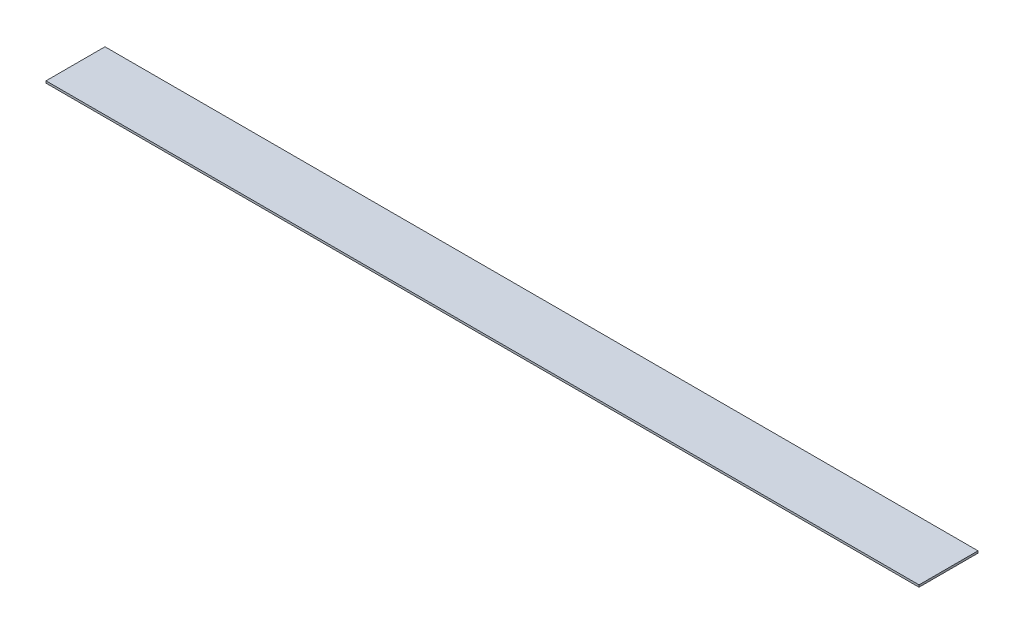
ISO-10303-21;
HEADER;
FILE_DESCRIPTION(('STEP AP214'),'2;1');
FILE_NAME('part.step','',(''),(''),'','','');
FILE_SCHEMA(('AUTOMOTIVE_DESIGN { 1 0 10303 214 1 1 1 1 }'));
ENDSEC;
DATA;
#1=APPLICATION_CONTEXT('core data for automotive mechanical design processes');
#2=APPLICATION_PROTOCOL_DEFINITION('international standard','automotive_design',2000,#1);
#3=PRODUCT_CONTEXT('',#1,'mechanical');
#4=PRODUCT('Part','Part','',(#3));
#5=PRODUCT_RELATED_PRODUCT_CATEGORY('part','',(#4));
#6=PRODUCT_DEFINITION_FORMATION('','',#4);
#7=PRODUCT_DEFINITION_CONTEXT('part definition',#1,'design');
#8=PRODUCT_DEFINITION('design','',#6,#7);
#9=PRODUCT_DEFINITION_SHAPE('','',#8);
#10=(LENGTH_UNIT() NAMED_UNIT(*) SI_UNIT(.MILLI.,.METRE.));
#11=(NAMED_UNIT(*) PLANE_ANGLE_UNIT() SI_UNIT($,.RADIAN.));
#12=(NAMED_UNIT(*) SI_UNIT($,.STERADIAN.) SOLID_ANGLE_UNIT());
#13=UNCERTAINTY_MEASURE_WITH_UNIT(LENGTH_MEASURE(1.E-05),#10,'distance_accuracy_value','');
#14=(GEOMETRIC_REPRESENTATION_CONTEXT(3) GLOBAL_UNCERTAINTY_ASSIGNED_CONTEXT((#13)) GLOBAL_UNIT_ASSIGNED_CONTEXT((#10,
#11,#12)) REPRESENTATION_CONTEXT('',''));
#15=CARTESIAN_POINT('',(0.,0.,0.));
#16=DIRECTION('',(0.,0.,1.));
#17=DIRECTION('',(1.,0.,0.));
#18=AXIS2_PLACEMENT_3D('',#15,#16,#17);
#19=CARTESIAN_POINT('',(0.,0.9,-12.8));
#20=DIRECTION('',(0.,0.,-1.));
#21=DIRECTION('',(-1.,0.,0.));
#22=AXIS2_PLACEMENT_3D('',#19,#20,#21);
#23=PLANE('',#22);
#24=DIRECTION('',(1.,0.,0.));
#25=VECTOR('',#24,1.);
#26=CARTESIAN_POINT('',(0.,0.9,-12.8));
#27=LINE('',#26,#25);
#28=CARTESIAN_POINT('',(-240.,0.9,-12.8));
#29=VERTEX_POINT('',#28);
#30=CARTESIAN_POINT('',(139.,0.9,-12.8));
#31=VERTEX_POINT('',#30);
#32=EDGE_CURVE('E80',#29,#31,#27,.T.);
#33=ORIENTED_EDGE('',*,*,#32,.T.);
#34=DIRECTION('',(0.,1.,0.));
#35=VECTOR('',#34,1.);
#36=CARTESIAN_POINT('',(139.,0.9,-12.8));
#37=LINE('',#36,#35);
#38=CARTESIAN_POINT('',(139.,0.,-12.8));
#39=VERTEX_POINT('',#38);
#40=EDGE_CURVE('E95',#39,#31,#37,.T.);
#41=ORIENTED_EDGE('',*,*,#40,.F.);
#42=DIRECTION('',(1.,0.,0.));
#43=VECTOR('',#42,1.);
#44=CARTESIAN_POINT('',(0.,0.,-12.8));
#45=LINE('',#44,#43);
#46=CARTESIAN_POINT('',(-240.,0.,-12.8));
#47=VERTEX_POINT('',#46);
#48=EDGE_CURVE('E84',#47,#39,#45,.T.);
#49=ORIENTED_EDGE('',*,*,#48,.F.);
#50=DIRECTION('',(0.,-1.,0.));
#51=VECTOR('',#50,1.);
#52=CARTESIAN_POINT('',(-240.,0.9,-12.8));
#53=LINE('',#52,#51);
#54=EDGE_CURVE('E11',#29,#47,#53,.T.);
#55=ORIENTED_EDGE('',*,*,#54,.F.);
#56=EDGE_LOOP('',(#33,#41,#49,#55));
#57=FACE_BOUND('',#56,.T.);
#58=ADVANCED_FACE('F35',(#57),#23,.T.);
#59=CARTESIAN_POINT('',(0.,0.9,12.8));
#60=DIRECTION('',(0.,0.,-1.));
#61=DIRECTION('',(-1.,0.,0.));
#62=AXIS2_PLACEMENT_3D('',#59,#60,#61);
#63=PLANE('',#62);
#64=DIRECTION('',(0.,-1.,0.));
#65=VECTOR('',#64,1.);
#66=CARTESIAN_POINT('',(139.,0.9,12.8));
#67=LINE('',#66,#65);
#68=CARTESIAN_POINT('',(139.,0.9,12.8));
#69=VERTEX_POINT('',#68);
#70=CARTESIAN_POINT('',(139.,0.,12.8));
#71=VERTEX_POINT('',#70);
#72=EDGE_CURVE('E49',#69,#71,#67,.T.);
#73=ORIENTED_EDGE('',*,*,#72,.F.);
#74=DIRECTION('',(1.,0.,0.));
#75=VECTOR('',#74,1.);
#76=CARTESIAN_POINT('',(0.,0.9,12.8));
#77=LINE('',#76,#75);
#78=CARTESIAN_POINT('',(-240.,0.9,12.8));
#79=VERTEX_POINT('',#78);
#80=EDGE_CURVE('E72',#79,#69,#77,.T.);
#81=ORIENTED_EDGE('',*,*,#80,.F.);
#82=DIRECTION('',(0.,-1.,0.));
#83=VECTOR('',#82,1.);
#84=CARTESIAN_POINT('',(-240.,0.9,12.8));
#85=LINE('',#84,#83);
#86=CARTESIAN_POINT('',(-240.,0.,12.8));
#87=VERTEX_POINT('',#86);
#88=EDGE_CURVE('E42',#79,#87,#85,.T.);
#89=ORIENTED_EDGE('',*,*,#88,.T.);
#90=DIRECTION('',(1.,0.,0.));
#91=VECTOR('',#90,1.);
#92=CARTESIAN_POINT('',(0.,0.,12.8));
#93=LINE('',#92,#91);
#94=EDGE_CURVE('E70',#87,#71,#93,.T.);
#95=ORIENTED_EDGE('',*,*,#94,.T.);
#96=EDGE_LOOP('',(#73,#81,#89,#95));
#97=FACE_BOUND('',#96,.T.);
#98=ADVANCED_FACE('F69',(#97),#63,.F.);
#99=CARTESIAN_POINT('',(0.,0.9,0.));
#100=DIRECTION('',(0.,1.,0.));
#101=DIRECTION('',(0.,0.,1.));
#102=AXIS2_PLACEMENT_3D('',#99,#100,#101);
#103=PLANE('',#102);
#104=ORIENTED_EDGE('',*,*,#80,.T.);
#105=DIRECTION('',(0.,0.,1.));
#106=VECTOR('',#105,1.);
#107=CARTESIAN_POINT('',(139.,0.9,12.8));
#108=LINE('',#107,#106);
#109=EDGE_CURVE('E86',#31,#69,#108,.T.);
#110=ORIENTED_EDGE('',*,*,#109,.F.);
#111=ORIENTED_EDGE('',*,*,#32,.F.);
#112=DIRECTION('',(0.,0.,-1.));
#113=VECTOR('',#112,1.);
#114=CARTESIAN_POINT('',(-240.,0.9,0.));
#115=LINE('',#114,#113);
#116=EDGE_CURVE('E90',#79,#29,#115,.T.);
#117=ORIENTED_EDGE('',*,*,#116,.F.);
#118=EDGE_LOOP('',(#104,#110,#111,#117));
#119=FACE_BOUND('',#118,.T.);
#120=ADVANCED_FACE('F109',(#119),#103,.T.);
#121=CARTESIAN_POINT('',(0.,0.,0.));
#122=DIRECTION('',(0.,1.,0.));
#123=DIRECTION('',(0.,0.,1.));
#124=AXIS2_PLACEMENT_3D('',#121,#122,#123);
#125=PLANE('',#124);
#126=DIRECTION('',(0.,0.,-1.));
#127=VECTOR('',#126,1.);
#128=CARTESIAN_POINT('',(139.,0.,12.8));
#129=LINE('',#128,#127);
#130=EDGE_CURVE('E79',#71,#39,#129,.T.);
#131=ORIENTED_EDGE('',*,*,#130,.F.);
#132=ORIENTED_EDGE('',*,*,#94,.F.);
#133=DIRECTION('',(0.,0.,-1.));
#134=VECTOR('',#133,1.);
#135=CARTESIAN_POINT('',(-240.,0.,0.));
#136=LINE('',#135,#134);
#137=EDGE_CURVE('E78',#87,#47,#136,.T.);
#138=ORIENTED_EDGE('',*,*,#137,.T.);
#139=ORIENTED_EDGE('',*,*,#48,.T.);
#140=EDGE_LOOP('',(#131,#132,#138,#139));
#141=FACE_BOUND('',#140,.T.);
#142=ADVANCED_FACE('F76',(#141),#125,.F.);
#143=CARTESIAN_POINT('',(-240.,0.9,0.));
#144=DIRECTION('',(-1.,0.,0.));
#145=DIRECTION('',(0.,0.,1.));
#146=AXIS2_PLACEMENT_3D('',#143,#144,#145);
#147=PLANE('',#146);
#148=ORIENTED_EDGE('',*,*,#137,.F.);
#149=ORIENTED_EDGE('',*,*,#88,.F.);
#150=ORIENTED_EDGE('',*,*,#116,.T.);
#151=ORIENTED_EDGE('',*,*,#54,.T.);
#152=EDGE_LOOP('',(#148,#149,#150,#151));
#153=FACE_BOUND('',#152,.T.);
#154=ADVANCED_FACE('F82',(#153),#147,.T.);
#155=CARTESIAN_POINT('',(139.,0.,0.));
#156=DIRECTION('',(1.,0.,0.));
#157=DIRECTION('',(0.,0.,-1.));
#158=AXIS2_PLACEMENT_3D('',#155,#156,#157);
#159=PLANE('',#158);
#160=ORIENTED_EDGE('',*,*,#72,.T.);
#161=ORIENTED_EDGE('',*,*,#130,.T.);
#162=ORIENTED_EDGE('',*,*,#40,.T.);
#163=ORIENTED_EDGE('',*,*,#109,.T.);
#164=EDGE_LOOP('',(#160,#161,#162,#163));
#165=FACE_BOUND('',#164,.T.);
#166=ADVANCED_FACE('F101',(#165),#159,.T.);
#167=CLOSED_SHELL('',(#58,#98,#120,#142,#154,#166));
#168=MANIFOLD_SOLID_BREP('B2',#167);
#169=ADVANCED_BREP_SHAPE_REPRESENTATION('',(#18,#168),#14);
#170=SHAPE_DEFINITION_REPRESENTATION(#9,#169);
ENDSEC;
END-ISO-10303-21;
